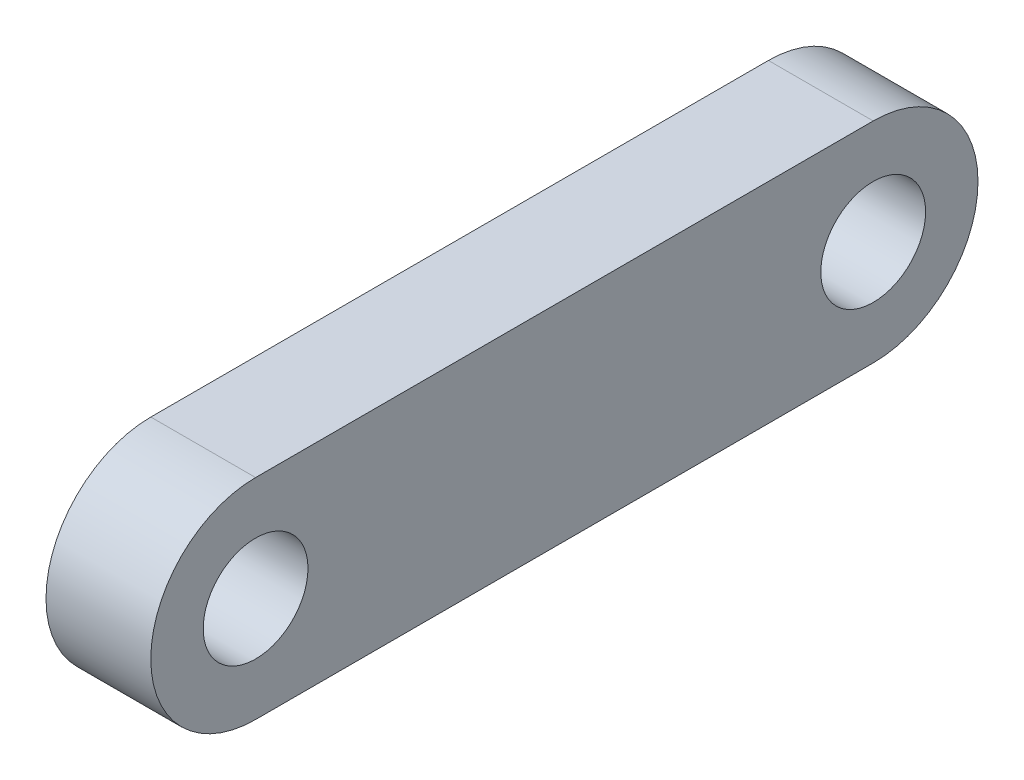
ISO-10303-21;
HEADER;
FILE_DESCRIPTION(('STEP AP214'),'2;1');
FILE_NAME('part.step','',(''),(''),'','','');
FILE_SCHEMA(('AUTOMOTIVE_DESIGN { 1 0 10303 214 1 1 1 1 }'));
ENDSEC;
DATA;
#1=APPLICATION_CONTEXT('core data for automotive mechanical design processes');
#2=APPLICATION_PROTOCOL_DEFINITION('international standard','automotive_design',2000,#1);
#3=PRODUCT_CONTEXT('',#1,'mechanical');
#4=PRODUCT('Part','Part','',(#3));
#5=PRODUCT_RELATED_PRODUCT_CATEGORY('part','',(#4));
#6=PRODUCT_DEFINITION_FORMATION('','',#4);
#7=PRODUCT_DEFINITION_CONTEXT('part definition',#1,'design');
#8=PRODUCT_DEFINITION('design','',#6,#7);
#9=PRODUCT_DEFINITION_SHAPE('','',#8);
#10=(LENGTH_UNIT() NAMED_UNIT(*) SI_UNIT(.MILLI.,.METRE.));
#11=(NAMED_UNIT(*) PLANE_ANGLE_UNIT() SI_UNIT($,.RADIAN.));
#12=(NAMED_UNIT(*) SI_UNIT($,.STERADIAN.) SOLID_ANGLE_UNIT());
#13=UNCERTAINTY_MEASURE_WITH_UNIT(LENGTH_MEASURE(1.E-05),#10,'distance_accuracy_value','');
#14=(GEOMETRIC_REPRESENTATION_CONTEXT(3) GLOBAL_UNCERTAINTY_ASSIGNED_CONTEXT((#13)) GLOBAL_UNIT_ASSIGNED_CONTEXT((#10,
#11,#12)) REPRESENTATION_CONTEXT('',''));
#15=CARTESIAN_POINT('',(0.,0.,0.));
#16=DIRECTION('',(0.,0.,1.));
#17=DIRECTION('',(1.,0.,0.));
#18=AXIS2_PLACEMENT_3D('',#15,#16,#17);
#19=CARTESIAN_POINT('',(5.,-5.,0.));
#20=DIRECTION('',(0.,1.,0.));
#21=DIRECTION('',(0.,0.,1.));
#22=AXIS2_PLACEMENT_3D('',#19,#20,#21);
#23=PLANE('',#22);
#24=DIRECTION('',(0.,0.,-1.));
#25=VECTOR('',#24,1.);
#26=CARTESIAN_POINT('',(0.,-5.,0.));
#27=LINE('',#26,#25);
#28=CARTESIAN_POINT('',(0.,-5.,0.));
#29=VERTEX_POINT('',#28);
#30=CARTESIAN_POINT('',(0.,-5.,-29.468465198574));
#31=VERTEX_POINT('',#30);
#32=EDGE_CURVE('E117',#29,#31,#27,.T.);
#33=ORIENTED_EDGE('',*,*,#32,.T.);
#34=DIRECTION('',(-1.,0.,0.));
#35=VECTOR('',#34,1.);
#36=CARTESIAN_POINT('',(5.,-5.,-29.468465198574));
#37=LINE('',#36,#35);
#38=CARTESIAN_POINT('',(5.,-5.,-29.468465198574));
#39=VERTEX_POINT('',#38);
#40=EDGE_CURVE('E11',#39,#31,#37,.T.);
#41=ORIENTED_EDGE('',*,*,#40,.F.);
#42=DIRECTION('',(0.,0.,-1.));
#43=VECTOR('',#42,1.);
#44=CARTESIAN_POINT('',(5.,-5.,0.));
#45=LINE('',#44,#43);
#46=CARTESIAN_POINT('',(5.,-5.,0.));
#47=VERTEX_POINT('',#46);
#48=EDGE_CURVE('E90',#47,#39,#45,.T.);
#49=ORIENTED_EDGE('',*,*,#48,.F.);
#50=DIRECTION('',(-1.,0.,0.));
#51=VECTOR('',#50,1.);
#52=CARTESIAN_POINT('',(5.,-5.,0.));
#53=LINE('',#52,#51);
#54=EDGE_CURVE('E116',#47,#29,#53,.T.);
#55=ORIENTED_EDGE('',*,*,#54,.T.);
#56=EDGE_LOOP('',(#33,#41,#49,#55));
#57=FACE_BOUND('',#56,.T.);
#58=ADVANCED_FACE('F41',(#57),#23,.F.);
#59=CARTESIAN_POINT('',(5.,0.,-29.468465198574));
#60=DIRECTION('',(-1.,0.,0.));
#61=DIRECTION('',(0.,0.,1.));
#62=AXIS2_PLACEMENT_3D('',#59,#60,#61);
#63=CYLINDRICAL_SURFACE('',#62,5.00000000000001);
#64=CARTESIAN_POINT('',(0.,0.,-29.468465198574));
#65=DIRECTION('',(1.,0.,0.));
#66=DIRECTION('',(0.,0.,-1.));
#67=AXIS2_PLACEMENT_3D('',#64,#65,#66);
#68=CIRCLE('',#67,5.00000000000001);
#69=CARTESIAN_POINT('',(0.,5.,-29.468465198574));
#70=VERTEX_POINT('',#69);
#71=EDGE_CURVE('E96',#31,#70,#68,.T.);
#72=ORIENTED_EDGE('',*,*,#71,.T.);
#73=DIRECTION('',(-1.,0.,0.));
#74=VECTOR('',#73,1.);
#75=CARTESIAN_POINT('',(5.,5.,-29.468465198574));
#76=LINE('',#75,#74);
#77=CARTESIAN_POINT('',(5.,5.,-29.468465198574));
#78=VERTEX_POINT('',#77);
#79=EDGE_CURVE('E50',#78,#70,#76,.T.);
#80=ORIENTED_EDGE('',*,*,#79,.F.);
#81=CARTESIAN_POINT('',(5.,0.,-29.468465198574));
#82=DIRECTION('',(1.,0.,0.));
#83=DIRECTION('',(0.,0.,-1.));
#84=AXIS2_PLACEMENT_3D('',#81,#82,#83);
#85=CIRCLE('',#84,5.00000000000001);
#86=EDGE_CURVE('E84',#39,#78,#85,.T.);
#87=ORIENTED_EDGE('',*,*,#86,.F.);
#88=ORIENTED_EDGE('',*,*,#40,.T.);
#89=EDGE_LOOP('',(#72,#80,#87,#88));
#90=FACE_BOUND('',#89,.T.);
#91=ADVANCED_FACE('F95',(#90),#63,.T.);
#92=CARTESIAN_POINT('',(5.,5.,0.));
#93=DIRECTION('',(0.,1.,0.));
#94=DIRECTION('',(0.,0.,1.));
#95=AXIS2_PLACEMENT_3D('',#92,#93,#94);
#96=PLANE('',#95);
#97=DIRECTION('',(0.,0.,-1.));
#98=VECTOR('',#97,1.);
#99=CARTESIAN_POINT('',(0.,5.,0.));
#100=LINE('',#99,#98);
#101=CARTESIAN_POINT('',(0.,5.,0.));
#102=VERTEX_POINT('',#101);
#103=EDGE_CURVE('E123',#102,#70,#100,.T.);
#104=ORIENTED_EDGE('',*,*,#103,.F.);
#105=DIRECTION('',(-1.,0.,0.));
#106=VECTOR('',#105,1.);
#107=CARTESIAN_POINT('',(5.,5.,0.));
#108=LINE('',#107,#106);
#109=CARTESIAN_POINT('',(5.,5.,0.));
#110=VERTEX_POINT('',#109);
#111=EDGE_CURVE('E74',#110,#102,#108,.T.);
#112=ORIENTED_EDGE('',*,*,#111,.F.);
#113=DIRECTION('',(0.,0.,-1.));
#114=VECTOR('',#113,1.);
#115=CARTESIAN_POINT('',(5.,5.,0.));
#116=LINE('',#115,#114);
#117=EDGE_CURVE('E88',#110,#78,#116,.T.);
#118=ORIENTED_EDGE('',*,*,#117,.T.);
#119=ORIENTED_EDGE('',*,*,#79,.T.);
#120=EDGE_LOOP('',(#104,#112,#118,#119));
#121=FACE_BOUND('',#120,.T.);
#122=ADVANCED_FACE('F101',(#121),#96,.T.);
#123=CARTESIAN_POINT('',(5.,0.,0.));
#124=DIRECTION('',(-1.,0.,0.));
#125=DIRECTION('',(0.,0.,1.));
#126=AXIS2_PLACEMENT_3D('',#123,#124,#125);
#127=CYLINDRICAL_SURFACE('',#126,2.5);
#128=CARTESIAN_POINT('',(5.,0.,0.));
#129=DIRECTION('',(1.,0.,0.));
#130=DIRECTION('',(0.,0.,-1.));
#131=AXIS2_PLACEMENT_3D('',#128,#129,#130);
#132=CIRCLE('',#131,2.5);
#133=CARTESIAN_POINT('',(5.,0.,-2.5));
#134=VERTEX_POINT('',#133);
#135=EDGE_CURVE('E105',#134,#134,#132,.T.);
#136=ORIENTED_EDGE('',*,*,#135,.T.);
#137=EDGE_LOOP('',(#136));
#138=FACE_BOUND('',#137,.T.);
#139=CARTESIAN_POINT('',(0.,0.,0.));
#140=DIRECTION('',(1.,0.,0.));
#141=DIRECTION('',(0.,0.,-1.));
#142=AXIS2_PLACEMENT_3D('',#139,#140,#141);
#143=CIRCLE('',#142,2.5);
#144=CARTESIAN_POINT('',(0.,0.,-2.5));
#145=VERTEX_POINT('',#144);
#146=EDGE_CURVE('E128',#145,#145,#143,.T.);
#147=ORIENTED_EDGE('',*,*,#146,.F.);
#148=EDGE_LOOP('',(#147));
#149=FACE_BOUND('',#148,.T.);
#150=ADVANCED_FACE('F160',(#138,#149),#127,.F.);
#151=CARTESIAN_POINT('',(5.,0.,0.));
#152=DIRECTION('',(-1.,0.,0.));
#153=DIRECTION('',(0.,0.,1.));
#154=AXIS2_PLACEMENT_3D('',#151,#152,#153);
#155=CYLINDRICAL_SURFACE('',#154,5.);
#156=CARTESIAN_POINT('',(0.,0.,0.));
#157=DIRECTION('',(1.,0.,0.));
#158=DIRECTION('',(0.,0.,-1.));
#159=AXIS2_PLACEMENT_3D('',#156,#157,#158);
#160=CIRCLE('',#159,5.);
#161=EDGE_CURVE('E77',#102,#29,#160,.T.);
#162=ORIENTED_EDGE('',*,*,#161,.T.);
#163=ORIENTED_EDGE('',*,*,#54,.F.);
#164=CARTESIAN_POINT('',(5.,0.,0.));
#165=DIRECTION('',(1.,0.,0.));
#166=DIRECTION('',(0.,0.,-1.));
#167=AXIS2_PLACEMENT_3D('',#164,#165,#166);
#168=CIRCLE('',#167,5.);
#169=EDGE_CURVE('E58',#110,#47,#168,.T.);
#170=ORIENTED_EDGE('',*,*,#169,.F.);
#171=ORIENTED_EDGE('',*,*,#111,.T.);
#172=EDGE_LOOP('',(#162,#163,#170,#171));
#173=FACE_BOUND('',#172,.T.);
#174=ADVANCED_FACE('F152',(#173),#155,.T.);
#175=CARTESIAN_POINT('',(5.,0.,-29.468465198574));
#176=DIRECTION('',(-1.,0.,0.));
#177=DIRECTION('',(0.,0.,1.));
#178=AXIS2_PLACEMENT_3D('',#175,#176,#177);
#179=CYLINDRICAL_SURFACE('',#178,2.50000000000001);
#180=CARTESIAN_POINT('',(5.,0.,-29.468465198574));
#181=DIRECTION('',(1.,0.,0.));
#182=DIRECTION('',(0.,0.,-1.));
#183=AXIS2_PLACEMENT_3D('',#180,#181,#182);
#184=CIRCLE('',#183,2.50000000000001);
#185=CARTESIAN_POINT('',(5.,0.,-31.968465198574));
#186=VERTEX_POINT('',#185);
#187=EDGE_CURVE('E112',#186,#186,#184,.T.);
#188=ORIENTED_EDGE('',*,*,#187,.T.);
#189=EDGE_LOOP('',(#188));
#190=FACE_BOUND('',#189,.T.);
#191=CARTESIAN_POINT('',(0.,0.,-29.468465198574));
#192=DIRECTION('',(1.,0.,0.));
#193=DIRECTION('',(0.,0.,-1.));
#194=AXIS2_PLACEMENT_3D('',#191,#192,#193);
#195=CIRCLE('',#194,2.50000000000001);
#196=CARTESIAN_POINT('',(0.,0.,-31.968465198574));
#197=VERTEX_POINT('',#196);
#198=EDGE_CURVE('E132',#197,#197,#195,.T.);
#199=ORIENTED_EDGE('',*,*,#198,.F.);
#200=EDGE_LOOP('',(#199));
#201=FACE_BOUND('',#200,.T.);
#202=ADVANCED_FACE('F150',(#190,#201),#179,.F.);
#203=CARTESIAN_POINT('',(5.,0.,0.));
#204=DIRECTION('',(1.,0.,0.));
#205=DIRECTION('',(0.,0.,-1.));
#206=AXIS2_PLACEMENT_3D('',#203,#204,#205);
#207=PLANE('',#206);
#208=ORIENTED_EDGE('',*,*,#48,.T.);
#209=ORIENTED_EDGE('',*,*,#86,.T.);
#210=ORIENTED_EDGE('',*,*,#117,.F.);
#211=ORIENTED_EDGE('',*,*,#169,.T.);
#212=EDGE_LOOP('',(#208,#209,#210,#211));
#213=FACE_BOUND('',#212,.T.);
#214=ORIENTED_EDGE('',*,*,#135,.F.);
#215=EDGE_LOOP('',(#214));
#216=FACE_BOUND('',#215,.T.);
#217=ORIENTED_EDGE('',*,*,#187,.F.);
#218=EDGE_LOOP('',(#217));
#219=FACE_BOUND('',#218,.T.);
#220=ADVANCED_FACE('F85',(#213,#216,#219),#207,.T.);
#221=CARTESIAN_POINT('',(0.,0.,0.));
#222=DIRECTION('',(1.,0.,0.));
#223=DIRECTION('',(0.,0.,-1.));
#224=AXIS2_PLACEMENT_3D('',#221,#222,#223);
#225=PLANE('',#224);
#226=ORIENTED_EDGE('',*,*,#32,.F.);
#227=ORIENTED_EDGE('',*,*,#161,.F.);
#228=ORIENTED_EDGE('',*,*,#103,.T.);
#229=ORIENTED_EDGE('',*,*,#71,.F.);
#230=EDGE_LOOP('',(#226,#227,#228,#229));
#231=FACE_BOUND('',#230,.T.);
#232=ORIENTED_EDGE('',*,*,#146,.T.);
#233=EDGE_LOOP('',(#232));
#234=FACE_BOUND('',#233,.T.);
#235=ORIENTED_EDGE('',*,*,#198,.T.);
#236=EDGE_LOOP('',(#235));
#237=FACE_BOUND('',#236,.T.);
#238=ADVANCED_FACE('F142',(#231,#234,#237),#225,.F.);
#239=CLOSED_SHELL('',(#58,#91,#122,#150,#174,#202,#220,#238));
#240=MANIFOLD_SOLID_BREP('B2',#239);
#241=ADVANCED_BREP_SHAPE_REPRESENTATION('',(#18,#240),#14);
#242=SHAPE_DEFINITION_REPRESENTATION(#9,#241);
ENDSEC;
END-ISO-10303-21;
